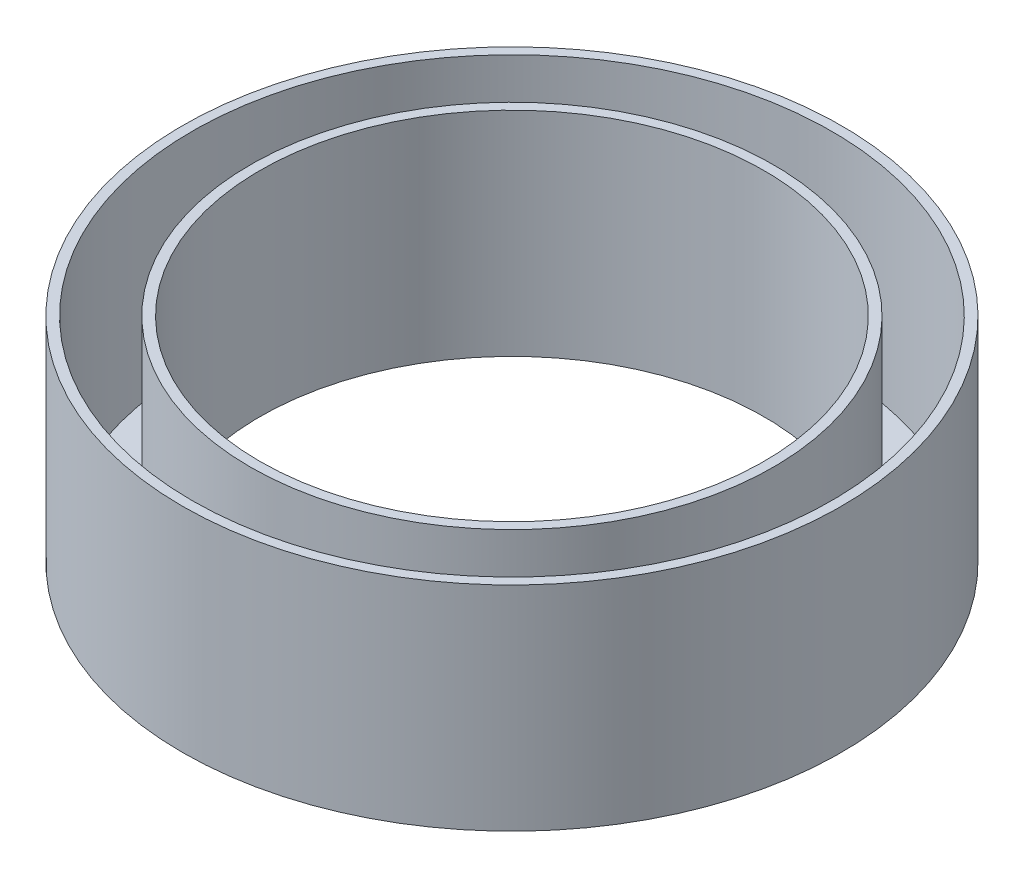
ISO-10303-21;
HEADER;
FILE_DESCRIPTION(('STEP AP214'),'2;1');
FILE_NAME('part.step','',(''),(''),'','','');
FILE_SCHEMA(('AUTOMOTIVE_DESIGN { 1 0 10303 214 1 1 1 1 }'));
ENDSEC;
DATA;
#1=APPLICATION_CONTEXT('core data for automotive mechanical design processes');
#2=APPLICATION_PROTOCOL_DEFINITION('international standard','automotive_design',2000,#1);
#3=PRODUCT_CONTEXT('',#1,'mechanical');
#4=PRODUCT('Part','Part','',(#3));
#5=PRODUCT_RELATED_PRODUCT_CATEGORY('part','',(#4));
#6=PRODUCT_DEFINITION_FORMATION('','',#4);
#7=PRODUCT_DEFINITION_CONTEXT('part definition',#1,'design');
#8=PRODUCT_DEFINITION('design','',#6,#7);
#9=PRODUCT_DEFINITION_SHAPE('','',#8);
#10=(LENGTH_UNIT() NAMED_UNIT(*) SI_UNIT(.MILLI.,.METRE.));
#11=(NAMED_UNIT(*) PLANE_ANGLE_UNIT() SI_UNIT($,.RADIAN.));
#12=(NAMED_UNIT(*) SI_UNIT($,.STERADIAN.) SOLID_ANGLE_UNIT());
#13=UNCERTAINTY_MEASURE_WITH_UNIT(LENGTH_MEASURE(1.E-05),#10,'distance_accuracy_value','');
#14=(GEOMETRIC_REPRESENTATION_CONTEXT(3) GLOBAL_UNCERTAINTY_ASSIGNED_CONTEXT((#13)) GLOBAL_UNIT_ASSIGNED_CONTEXT((#10,
#11,#12)) REPRESENTATION_CONTEXT('',''));
#15=CARTESIAN_POINT('',(0.,0.,0.));
#16=DIRECTION('',(0.,0.,1.));
#17=DIRECTION('',(1.,0.,0.));
#18=AXIS2_PLACEMENT_3D('',#15,#16,#17);
#19=CARTESIAN_POINT('',(0.,11.,0.));
#20=DIRECTION('',(0.,1.,0.));
#21=DIRECTION('',(0.,0.,1.));
#22=AXIS2_PLACEMENT_3D('',#19,#20,#21);
#23=PLANE('',#22);
#24=CARTESIAN_POINT('',(0.,11.,0.));
#25=DIRECTION('',(0.,1.,0.));
#26=DIRECTION('',(0.,0.,1.));
#27=AXIS2_PLACEMENT_3D('',#24,#25,#26);
#28=CIRCLE('',#27,13.);
#29=CARTESIAN_POINT('',(0.,11.,13.));
#30=VERTEX_POINT('',#29);
#31=EDGE_CURVE('E55',#30,#30,#28,.T.);
#32=ORIENTED_EDGE('',*,*,#31,.F.);
#33=EDGE_LOOP('',(#32));
#34=FACE_BOUND('',#33,.T.);
#35=CARTESIAN_POINT('',(0.,11.,0.));
#36=DIRECTION('',(0.,1.,0.));
#37=DIRECTION('',(0.,0.,1.));
#38=AXIS2_PLACEMENT_3D('',#35,#36,#37);
#39=CIRCLE('',#38,13.5);
#40=CARTESIAN_POINT('',(0.,11.,13.5));
#41=VERTEX_POINT('',#40);
#42=EDGE_CURVE('E73',#41,#41,#39,.T.);
#43=ORIENTED_EDGE('',*,*,#42,.T.);
#44=EDGE_LOOP('',(#43));
#45=FACE_BOUND('',#44,.T.);
#46=ADVANCED_FACE('F41',(#34,#45),#23,.T.);
#47=CARTESIAN_POINT('',(0.,11.,0.));
#48=DIRECTION('',(0.,1.,0.));
#49=DIRECTION('',(0.,0.,1.));
#50=AXIS2_PLACEMENT_3D('',#47,#48,#49);
#51=CIRCLE('',#50,16.5);
#52=CARTESIAN_POINT('',(0.,11.,16.5));
#53=VERTEX_POINT('',#52);
#54=EDGE_CURVE('E65',#53,#53,#51,.T.);
#55=ORIENTED_EDGE('',*,*,#54,.F.);
#56=EDGE_LOOP('',(#55));
#57=FACE_BOUND('',#56,.T.);
#58=CARTESIAN_POINT('',(0.,11.,0.));
#59=DIRECTION('',(0.,1.,0.));
#60=DIRECTION('',(0.,0.,1.));
#61=AXIS2_PLACEMENT_3D('',#58,#59,#60);
#62=CIRCLE('',#61,17.);
#63=CARTESIAN_POINT('',(0.,11.,17.));
#64=VERTEX_POINT('',#63);
#65=EDGE_CURVE('E10',#64,#64,#62,.T.);
#66=ORIENTED_EDGE('',*,*,#65,.T.);
#67=EDGE_LOOP('',(#66));
#68=FACE_BOUND('',#67,.T.);
#69=ADVANCED_FACE('F96',(#57,#68),#23,.T.);
#70=CARTESIAN_POINT('',(0.,0.,0.));
#71=DIRECTION('',(0.,1.,0.));
#72=DIRECTION('',(0.,0.,1.));
#73=AXIS2_PLACEMENT_3D('',#70,#71,#72);
#74=PLANE('',#73);
#75=CARTESIAN_POINT('',(0.,0.,0.));
#76=DIRECTION('',(0.,1.,0.));
#77=DIRECTION('',(0.,0.,1.));
#78=AXIS2_PLACEMENT_3D('',#75,#76,#77);
#79=CIRCLE('',#78,17.);
#80=CARTESIAN_POINT('',(0.,0.,17.));
#81=VERTEX_POINT('',#80);
#82=EDGE_CURVE('E45',#81,#81,#79,.T.);
#83=ORIENTED_EDGE('',*,*,#82,.F.);
#84=EDGE_LOOP('',(#83));
#85=FACE_BOUND('',#84,.T.);
#86=CARTESIAN_POINT('',(0.,0.,0.));
#87=DIRECTION('',(0.,1.,0.));
#88=DIRECTION('',(0.,0.,1.));
#89=AXIS2_PLACEMENT_3D('',#86,#87,#88);
#90=CIRCLE('',#89,13.);
#91=CARTESIAN_POINT('',(0.,0.,13.));
#92=VERTEX_POINT('',#91);
#93=EDGE_CURVE('E57',#92,#92,#90,.T.);
#94=ORIENTED_EDGE('',*,*,#93,.T.);
#95=EDGE_LOOP('',(#94));
#96=FACE_BOUND('',#95,.T.);
#97=ADVANCED_FACE('F98',(#85,#96),#74,.F.);
#98=CARTESIAN_POINT('',(0.,11.,0.));
#99=DIRECTION('',(0.,-1.,0.));
#100=DIRECTION('',(0.,0.,-1.));
#101=AXIS2_PLACEMENT_3D('',#98,#99,#100);
#102=CYLINDRICAL_SURFACE('',#101,17.);
#103=ORIENTED_EDGE('',*,*,#65,.F.);
#104=EDGE_LOOP('',(#103));
#105=FACE_BOUND('',#104,.T.);
#106=ORIENTED_EDGE('',*,*,#82,.T.);
#107=EDGE_LOOP('',(#106));
#108=FACE_BOUND('',#107,.T.);
#109=ADVANCED_FACE('F43',(#105,#108),#102,.T.);
#110=CARTESIAN_POINT('',(0.,11.,0.));
#111=DIRECTION('',(0.,-1.,0.));
#112=DIRECTION('',(0.,0.,-1.));
#113=AXIS2_PLACEMENT_3D('',#110,#111,#112);
#114=CYLINDRICAL_SURFACE('',#113,13.);
#115=ORIENTED_EDGE('',*,*,#31,.T.);
#116=EDGE_LOOP('',(#115));
#117=FACE_BOUND('',#116,.T.);
#118=ORIENTED_EDGE('',*,*,#93,.F.);
#119=EDGE_LOOP('',(#118));
#120=FACE_BOUND('',#119,.T.);
#121=ADVANCED_FACE('F92',(#117,#120),#114,.F.);
#122=CARTESIAN_POINT('',(0.,0.399999999999999,0.));
#123=DIRECTION('',(0.,1.,0.));
#124=DIRECTION('',(0.,0.,1.));
#125=AXIS2_PLACEMENT_3D('',#122,#123,#124);
#126=CYLINDRICAL_SURFACE('',#125,16.5);
#127=CARTESIAN_POINT('',(0.,0.399999999999999,0.));
#128=DIRECTION('',(0.,1.,0.));
#129=DIRECTION('',(0.,0.,1.));
#130=AXIS2_PLACEMENT_3D('',#127,#128,#129);
#131=CIRCLE('',#130,16.5);
#132=CARTESIAN_POINT('',(0.,0.399999999999999,16.5));
#133=VERTEX_POINT('',#132);
#134=EDGE_CURVE('E61',#133,#133,#131,.T.);
#135=ORIENTED_EDGE('',*,*,#134,.F.);
#136=EDGE_LOOP('',(#135));
#137=FACE_BOUND('',#136,.T.);
#138=ORIENTED_EDGE('',*,*,#54,.T.);
#139=EDGE_LOOP('',(#138));
#140=FACE_BOUND('',#139,.T.);
#141=ADVANCED_FACE('F86',(#137,#140),#126,.F.);
#142=CARTESIAN_POINT('',(0.,0.399999999999999,0.));
#143=DIRECTION('',(0.,1.,0.));
#144=DIRECTION('',(0.,0.,1.));
#145=AXIS2_PLACEMENT_3D('',#142,#143,#144);
#146=PLANE('',#145);
#147=CARTESIAN_POINT('',(0.,0.399999999999999,0.));
#148=DIRECTION('',(0.,1.,0.));
#149=DIRECTION('',(0.,0.,1.));
#150=AXIS2_PLACEMENT_3D('',#147,#148,#149);
#151=CIRCLE('',#150,13.5);
#152=CARTESIAN_POINT('',(0.,0.399999999999999,13.5));
#153=VERTEX_POINT('',#152);
#154=EDGE_CURVE('E69',#153,#153,#151,.T.);
#155=ORIENTED_EDGE('',*,*,#154,.F.);
#156=EDGE_LOOP('',(#155));
#157=FACE_BOUND('',#156,.T.);
#158=ORIENTED_EDGE('',*,*,#134,.T.);
#159=EDGE_LOOP('',(#158));
#160=FACE_BOUND('',#159,.T.);
#161=ADVANCED_FACE('F83',(#157,#160),#146,.T.);
#162=CARTESIAN_POINT('',(0.,0.399999999999999,0.));
#163=DIRECTION('',(0.,1.,0.));
#164=DIRECTION('',(0.,0.,1.));
#165=AXIS2_PLACEMENT_3D('',#162,#163,#164);
#166=CYLINDRICAL_SURFACE('',#165,13.5);
#167=ORIENTED_EDGE('',*,*,#154,.T.);
#168=EDGE_LOOP('',(#167));
#169=FACE_BOUND('',#168,.T.);
#170=ORIENTED_EDGE('',*,*,#42,.F.);
#171=EDGE_LOOP('',(#170));
#172=FACE_BOUND('',#171,.T.);
#173=ADVANCED_FACE('F80',(#169,#172),#166,.T.);
#174=CLOSED_SHELL('',(#46,#69,#97,#109,#121,#141,#161,#173));
#175=MANIFOLD_SOLID_BREP('B2',#174);
#176=ADVANCED_BREP_SHAPE_REPRESENTATION('',(#18,#175),#14);
#177=SHAPE_DEFINITION_REPRESENTATION(#9,#176);
ENDSEC;
END-ISO-10303-21;
